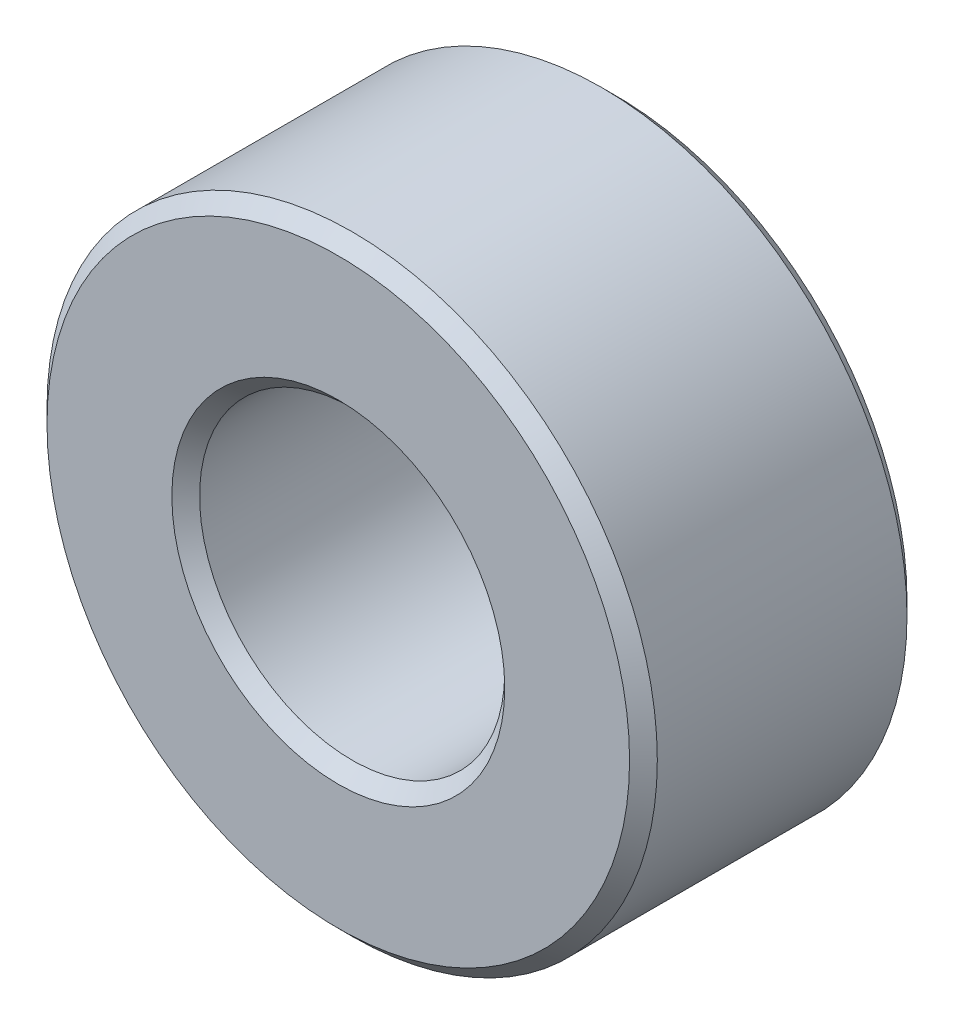
ISO-10303-21;
HEADER;
FILE_DESCRIPTION(('STEP AP214'),'2;1');
FILE_NAME('part.step','',(''),(''),'','','');
FILE_SCHEMA(('AUTOMOTIVE_DESIGN { 1 0 10303 214 1 1 1 1 }'));
ENDSEC;
DATA;
#1=APPLICATION_CONTEXT('core data for automotive mechanical design processes');
#2=APPLICATION_PROTOCOL_DEFINITION('international standard','automotive_design',2000,#1);
#3=PRODUCT_CONTEXT('',#1,'mechanical');
#4=PRODUCT('Part','Part','',(#3));
#5=PRODUCT_RELATED_PRODUCT_CATEGORY('part','',(#4));
#6=PRODUCT_DEFINITION_FORMATION('','',#4);
#7=PRODUCT_DEFINITION_CONTEXT('part definition',#1,'design');
#8=PRODUCT_DEFINITION('design','',#6,#7);
#9=PRODUCT_DEFINITION_SHAPE('','',#8);
#10=(LENGTH_UNIT() NAMED_UNIT(*) SI_UNIT(.MILLI.,.METRE.));
#11=(NAMED_UNIT(*) PLANE_ANGLE_UNIT() SI_UNIT($,.RADIAN.));
#12=(NAMED_UNIT(*) SI_UNIT($,.STERADIAN.) SOLID_ANGLE_UNIT());
#13=UNCERTAINTY_MEASURE_WITH_UNIT(LENGTH_MEASURE(1.E-05),#10,'distance_accuracy_value','');
#14=(GEOMETRIC_REPRESENTATION_CONTEXT(3) GLOBAL_UNCERTAINTY_ASSIGNED_CONTEXT((#13)) GLOBAL_UNIT_ASSIGNED_CONTEXT((#10,
#11,#12)) REPRESENTATION_CONTEXT('',''));
#15=CARTESIAN_POINT('',(0.,0.,0.));
#16=DIRECTION('',(0.,0.,1.));
#17=DIRECTION('',(1.,0.,0.));
#18=AXIS2_PLACEMENT_3D('',#15,#16,#17);
#19=CARTESIAN_POINT('',(0.,0.,10.));
#20=DIRECTION('',(0.,0.,1.));
#21=DIRECTION('',(1.,0.,0.));
#22=AXIS2_PLACEMENT_3D('',#19,#20,#21);
#23=PLANE('',#22);
#24=CARTESIAN_POINT('',(0.,0.,10.));
#25=DIRECTION('',(0.,0.,1.));
#26=DIRECTION('',(1.,0.,0.));
#27=AXIS2_PLACEMENT_3D('',#24,#25,#26);
#28=CIRCLE('',#27,6.00000000000001);
#29=CARTESIAN_POINT('',(6.00000000000001,0.,10.));
#30=VERTEX_POINT('',#29);
#31=EDGE_CURVE('E50',#30,#30,#28,.F.);
#32=ORIENTED_EDGE('',*,*,#31,.T.);
#33=EDGE_LOOP('',(#32));
#34=FACE_BOUND('',#33,.T.);
#35=CARTESIAN_POINT('',(0.,0.,10.));
#36=DIRECTION('',(0.,0.,1.));
#37=DIRECTION('',(1.,0.,0.));
#38=AXIS2_PLACEMENT_3D('',#35,#36,#37);
#39=CIRCLE('',#38,10.5);
#40=CARTESIAN_POINT('',(10.5,0.,10.));
#41=VERTEX_POINT('',#40);
#42=EDGE_CURVE('E54',#41,#41,#39,.T.);
#43=ORIENTED_EDGE('',*,*,#42,.T.);
#44=EDGE_LOOP('',(#43));
#45=FACE_BOUND('',#44,.T.);
#46=ADVANCED_FACE('F38',(#34,#45),#23,.T.);
#47=CARTESIAN_POINT('',(0.,0.,0.));
#48=DIRECTION('',(0.,0.,1.));
#49=DIRECTION('',(1.,0.,0.));
#50=AXIS2_PLACEMENT_3D('',#47,#48,#49);
#51=PLANE('',#50);
#52=CARTESIAN_POINT('',(0.,0.,0.));
#53=DIRECTION('',(0.,0.,1.));
#54=DIRECTION('',(1.,0.,0.));
#55=AXIS2_PLACEMENT_3D('',#52,#53,#54);
#56=CIRCLE('',#55,6.);
#57=CARTESIAN_POINT('',(6.,0.,0.));
#58=VERTEX_POINT('',#57);
#59=EDGE_CURVE('E65',#58,#58,#56,.T.);
#60=ORIENTED_EDGE('',*,*,#59,.T.);
#61=EDGE_LOOP('',(#60));
#62=FACE_BOUND('',#61,.T.);
#63=CARTESIAN_POINT('',(0.,0.,0.));
#64=DIRECTION('',(0.,0.,1.));
#65=DIRECTION('',(1.,0.,0.));
#66=AXIS2_PLACEMENT_3D('',#63,#64,#65);
#67=CIRCLE('',#66,10.5);
#68=CARTESIAN_POINT('',(10.5,0.,0.));
#69=VERTEX_POINT('',#68);
#70=EDGE_CURVE('E68',#69,#69,#67,.F.);
#71=ORIENTED_EDGE('',*,*,#70,.T.);
#72=EDGE_LOOP('',(#71));
#73=FACE_BOUND('',#72,.T.);
#74=ADVANCED_FACE('F72',(#62,#73),#51,.F.);
#75=CARTESIAN_POINT('',(0.,0.,10.));
#76=DIRECTION('',(0.,0.,-1.));
#77=DIRECTION('',(-1.,0.,0.));
#78=AXIS2_PLACEMENT_3D('',#75,#76,#77);
#79=CYLINDRICAL_SURFACE('',#78,11.);
#80=CARTESIAN_POINT('',(0.,0.,0.5));
#81=DIRECTION('',(0.,0.,1.));
#82=DIRECTION('',(1.,0.,0.));
#83=AXIS2_PLACEMENT_3D('',#80,#81,#82);
#84=CIRCLE('',#83,11.);
#85=CARTESIAN_POINT('',(11.,0.,0.5));
#86=VERTEX_POINT('',#85);
#87=EDGE_CURVE('E10',#86,#86,#84,.T.);
#88=ORIENTED_EDGE('',*,*,#87,.T.);
#89=EDGE_LOOP('',(#88));
#90=FACE_BOUND('',#89,.T.);
#91=CARTESIAN_POINT('',(0.,0.,9.49999999999999));
#92=DIRECTION('',(0.,0.,1.));
#93=DIRECTION('',(1.,0.,0.));
#94=AXIS2_PLACEMENT_3D('',#91,#92,#93);
#95=CIRCLE('',#94,11.);
#96=CARTESIAN_POINT('',(11.,0.,9.49999999999999));
#97=VERTEX_POINT('',#96);
#98=EDGE_CURVE('E46',#97,#97,#95,.F.);
#99=ORIENTED_EDGE('',*,*,#98,.T.);
#100=EDGE_LOOP('',(#99));
#101=FACE_BOUND('',#100,.T.);
#102=ADVANCED_FACE('F93',(#90,#101),#79,.T.);
#103=CARTESIAN_POINT('',(0.,0.,10.));
#104=DIRECTION('',(0.,0.,-1.));
#105=DIRECTION('',(-1.,0.,0.));
#106=AXIS2_PLACEMENT_3D('',#103,#104,#105);
#107=CYLINDRICAL_SURFACE('',#106,5.5);
#108=CARTESIAN_POINT('',(0.,0.,0.500000000000004));
#109=DIRECTION('',(0.,0.,1.));
#110=DIRECTION('',(1.,0.,0.));
#111=AXIS2_PLACEMENT_3D('',#108,#109,#110);
#112=CIRCLE('',#111,5.5);
#113=CARTESIAN_POINT('',(5.5,0.,0.500000000000004));
#114=VERTEX_POINT('',#113);
#115=EDGE_CURVE('E59',#114,#114,#112,.F.);
#116=ORIENTED_EDGE('',*,*,#115,.T.);
#117=EDGE_LOOP('',(#116));
#118=FACE_BOUND('',#117,.T.);
#119=CARTESIAN_POINT('',(0.,0.,9.49999999999999));
#120=DIRECTION('',(0.,0.,1.));
#121=DIRECTION('',(1.,0.,0.));
#122=AXIS2_PLACEMENT_3D('',#119,#120,#121);
#123=CIRCLE('',#122,5.5);
#124=CARTESIAN_POINT('',(5.5,0.,9.49999999999999));
#125=VERTEX_POINT('',#124);
#126=EDGE_CURVE('E62',#125,#125,#123,.T.);
#127=ORIENTED_EDGE('',*,*,#126,.T.);
#128=EDGE_LOOP('',(#127));
#129=FACE_BOUND('',#128,.T.);
#130=ADVANCED_FACE('F98',(#118,#129),#107,.F.);
#131=CARTESIAN_POINT('',(0.,0.,0.));
#132=DIRECTION('',(0.,0.,-1.));
#133=DIRECTION('',(-1.,0.,0.));
#134=AXIS2_PLACEMENT_3D('',#131,#132,#133);
#135=CONICAL_SURFACE('',#134,6.,0.785398163397443);
#136=ORIENTED_EDGE('',*,*,#115,.F.);
#137=EDGE_LOOP('',(#136));
#138=FACE_BOUND('',#137,.T.);
#139=ORIENTED_EDGE('',*,*,#59,.F.);
#140=EDGE_LOOP('',(#139));
#141=FACE_BOUND('',#140,.T.);
#142=ADVANCED_FACE('F83',(#138,#141),#135,.F.);
#143=CARTESIAN_POINT('',(0.,0.,9.49999999999999));
#144=DIRECTION('',(0.,0.,1.));
#145=DIRECTION('',(1.,0.,0.));
#146=AXIS2_PLACEMENT_3D('',#143,#144,#145);
#147=CONICAL_SURFACE('',#146,5.5,0.78539816339745);
#148=ORIENTED_EDGE('',*,*,#31,.F.);
#149=EDGE_LOOP('',(#148));
#150=FACE_BOUND('',#149,.T.);
#151=ORIENTED_EDGE('',*,*,#126,.F.);
#152=EDGE_LOOP('',(#151));
#153=FACE_BOUND('',#152,.T.);
#154=ADVANCED_FACE('F77',(#150,#153),#147,.F.);
#155=CARTESIAN_POINT('',(0.,0.,0.5));
#156=DIRECTION('',(0.,0.,1.));
#157=DIRECTION('',(1.,0.,0.));
#158=AXIS2_PLACEMENT_3D('',#155,#156,#157);
#159=CONICAL_SURFACE('',#158,11.,0.78539816339745);
#160=ORIENTED_EDGE('',*,*,#70,.F.);
#161=EDGE_LOOP('',(#160));
#162=FACE_BOUND('',#161,.T.);
#163=ORIENTED_EDGE('',*,*,#87,.F.);
#164=EDGE_LOOP('',(#163));
#165=FACE_BOUND('',#164,.T.);
#166=ADVANCED_FACE('F74',(#162,#165),#159,.T.);
#167=CARTESIAN_POINT('',(0.,0.,10.));
#168=DIRECTION('',(0.,0.,-1.));
#169=DIRECTION('',(-1.,0.,0.));
#170=AXIS2_PLACEMENT_3D('',#167,#168,#169);
#171=CONICAL_SURFACE('',#170,10.5,0.785398163397443);
#172=ORIENTED_EDGE('',*,*,#98,.F.);
#173=EDGE_LOOP('',(#172));
#174=FACE_BOUND('',#173,.T.);
#175=ORIENTED_EDGE('',*,*,#42,.F.);
#176=EDGE_LOOP('',(#175));
#177=FACE_BOUND('',#176,.T.);
#178=ADVANCED_FACE('F41',(#174,#177),#171,.T.);
#179=CLOSED_SHELL('',(#46,#74,#102,#130,#142,#154,#166,#178));
#180=MANIFOLD_SOLID_BREP('B2',#179);
#181=ADVANCED_BREP_SHAPE_REPRESENTATION('',(#18,#180),#14);
#182=SHAPE_DEFINITION_REPRESENTATION(#9,#181);
ENDSEC;
END-ISO-10303-21;
